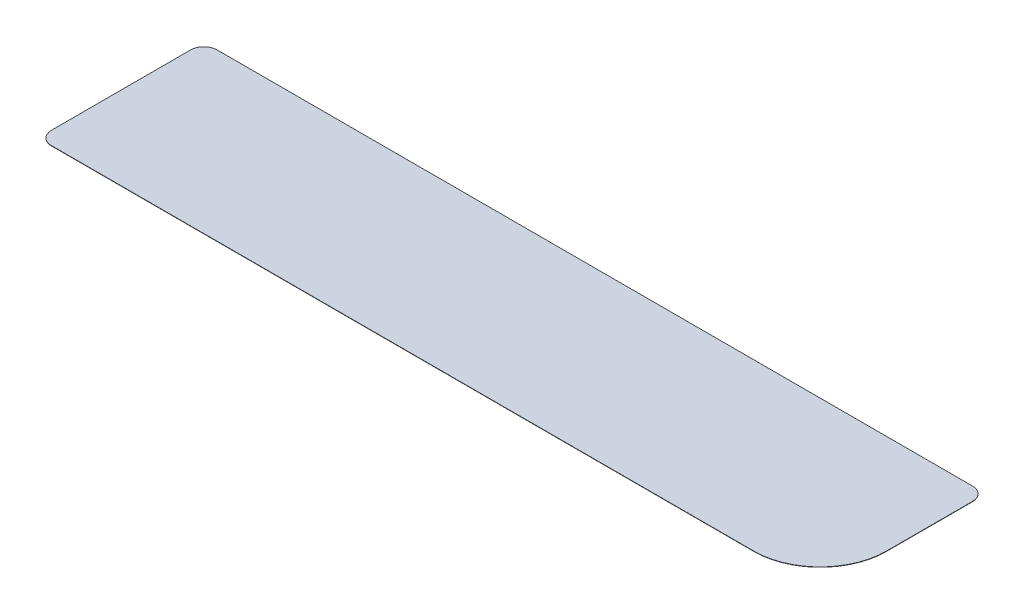
ISO-10303-21;
HEADER;
FILE_DESCRIPTION(('STEP AP214'),'2;1');
FILE_NAME('part.step','',(''),(''),'','','');
FILE_SCHEMA(('AUTOMOTIVE_DESIGN { 1 0 10303 214 1 1 1 1 }'));
ENDSEC;
DATA;
#1=APPLICATION_CONTEXT('core data for automotive mechanical design processes');
#2=APPLICATION_PROTOCOL_DEFINITION('international standard','automotive_design',2000,#1);
#3=PRODUCT_CONTEXT('',#1,'mechanical');
#4=PRODUCT('Part','Part','',(#3));
#5=PRODUCT_RELATED_PRODUCT_CATEGORY('part','',(#4));
#6=PRODUCT_DEFINITION_FORMATION('','',#4);
#7=PRODUCT_DEFINITION_CONTEXT('part definition',#1,'design');
#8=PRODUCT_DEFINITION('design','',#6,#7);
#9=PRODUCT_DEFINITION_SHAPE('','',#8);
#10=(LENGTH_UNIT() NAMED_UNIT(*) SI_UNIT(.MILLI.,.METRE.));
#11=(NAMED_UNIT(*) PLANE_ANGLE_UNIT() SI_UNIT($,.RADIAN.));
#12=(NAMED_UNIT(*) SI_UNIT($,.STERADIAN.) SOLID_ANGLE_UNIT());
#13=UNCERTAINTY_MEASURE_WITH_UNIT(LENGTH_MEASURE(1.E-05),#10,'distance_accuracy_value','');
#14=(GEOMETRIC_REPRESENTATION_CONTEXT(3) GLOBAL_UNCERTAINTY_ASSIGNED_CONTEXT((#13)) GLOBAL_UNIT_ASSIGNED_CONTEXT((#10,
#11,#12)) REPRESENTATION_CONTEXT('',''));
#15=CARTESIAN_POINT('',(0.,0.,0.));
#16=DIRECTION('',(0.,0.,1.));
#17=DIRECTION('',(1.,0.,0.));
#18=AXIS2_PLACEMENT_3D('',#15,#16,#17);
#19=CARTESIAN_POINT('',(116.,0.05,-10.5));
#20=DIRECTION('',(0.,-1.,0.));
#21=DIRECTION('',(0.,0.,-1.));
#22=AXIS2_PLACEMENT_3D('',#19,#20,#21);
#23=CYLINDRICAL_SURFACE('',#22,2.);
#24=CARTESIAN_POINT('',(116.,0.,-10.5));
#25=DIRECTION('',(0.,1.,0.));
#26=DIRECTION('',(0.,0.,-1.));
#27=AXIS2_PLACEMENT_3D('',#24,#25,#26);
#28=CIRCLE('',#27,2.);
#29=CARTESIAN_POINT('',(118.,0.,-10.5));
#30=VERTEX_POINT('',#29);
#31=CARTESIAN_POINT('',(116.,0.,-12.5));
#32=VERTEX_POINT('',#31);
#33=EDGE_CURVE('E135',#30,#32,#28,.T.);
#34=ORIENTED_EDGE('',*,*,#33,.T.);
#35=DIRECTION('',(0.,-1.,0.));
#36=VECTOR('',#35,1.);
#37=CARTESIAN_POINT('',(116.,0.05,-12.5));
#38=LINE('',#37,#36);
#39=CARTESIAN_POINT('',(116.,0.05,-12.5));
#40=VERTEX_POINT('',#39);
#41=EDGE_CURVE('E11',#40,#32,#38,.T.);
#42=ORIENTED_EDGE('',*,*,#41,.F.);
#43=CARTESIAN_POINT('',(116.,0.05,-10.5));
#44=DIRECTION('',(0.,1.,0.));
#45=DIRECTION('',(0.,0.,-1.));
#46=AXIS2_PLACEMENT_3D('',#43,#44,#45);
#47=CIRCLE('',#46,2.);
#48=CARTESIAN_POINT('',(118.,0.05,-10.5));
#49=VERTEX_POINT('',#48);
#50=EDGE_CURVE('E149',#49,#40,#47,.T.);
#51=ORIENTED_EDGE('',*,*,#50,.F.);
#52=DIRECTION('',(0.,-1.,0.));
#53=VECTOR('',#52,1.);
#54=CARTESIAN_POINT('',(118.,0.05,-10.5));
#55=LINE('',#54,#53);
#56=EDGE_CURVE('E131',#49,#30,#55,.T.);
#57=ORIENTED_EDGE('',*,*,#56,.T.);
#58=EDGE_LOOP('',(#34,#42,#51,#57));
#59=FACE_BOUND('',#58,.T.);
#60=ADVANCED_FACE('F39',(#59),#23,.T.);
#61=CARTESIAN_POINT('',(1.99999999999999,0.05,-12.5));
#62=DIRECTION('',(0.,0.,1.));
#63=DIRECTION('',(1.,0.,0.));
#64=AXIS2_PLACEMENT_3D('',#61,#62,#63);
#65=PLANE('',#64);
#66=DIRECTION('',(-1.,0.,0.));
#67=VECTOR('',#66,1.);
#68=CARTESIAN_POINT('',(1.99999999999999,0.,-12.5));
#69=LINE('',#68,#67);
#70=CARTESIAN_POINT('',(1.99999999999999,0.,-12.5));
#71=VERTEX_POINT('',#70);
#72=EDGE_CURVE('E138',#32,#71,#69,.T.);
#73=ORIENTED_EDGE('',*,*,#72,.T.);
#74=DIRECTION('',(0.,-1.,0.));
#75=VECTOR('',#74,1.);
#76=CARTESIAN_POINT('',(1.99999999999999,0.05,-12.5));
#77=LINE('',#76,#75);
#78=CARTESIAN_POINT('',(1.99999999999999,0.05,-12.5));
#79=VERTEX_POINT('',#78);
#80=EDGE_CURVE('E47',#79,#71,#77,.T.);
#81=ORIENTED_EDGE('',*,*,#80,.F.);
#82=DIRECTION('',(-1.,0.,0.));
#83=VECTOR('',#82,1.);
#84=CARTESIAN_POINT('',(1.99999999999999,0.05,-12.5));
#85=LINE('',#84,#83);
#86=EDGE_CURVE('E98',#40,#79,#85,.T.);
#87=ORIENTED_EDGE('',*,*,#86,.F.);
#88=ORIENTED_EDGE('',*,*,#41,.T.);
#89=EDGE_LOOP('',(#73,#81,#87,#88));
#90=FACE_BOUND('',#89,.T.);
#91=ADVANCED_FACE('F184',(#90),#65,.F.);
#92=CARTESIAN_POINT('',(2.,0.05,-10.5));
#93=DIRECTION('',(0.,-1.,0.));
#94=DIRECTION('',(0.,0.,-1.));
#95=AXIS2_PLACEMENT_3D('',#92,#93,#94);
#96=CYLINDRICAL_SURFACE('',#95,2.);
#97=CARTESIAN_POINT('',(2.,0.,-10.5));
#98=DIRECTION('',(0.,1.,0.));
#99=DIRECTION('',(0.,0.,-1.));
#100=AXIS2_PLACEMENT_3D('',#97,#98,#99);
#101=CIRCLE('',#100,2.);
#102=CARTESIAN_POINT('',(0.,0.,-10.5));
#103=VERTEX_POINT('',#102);
#104=EDGE_CURVE('E140',#71,#103,#101,.T.);
#105=ORIENTED_EDGE('',*,*,#104,.T.);
#106=DIRECTION('',(0.,-1.,0.));
#107=VECTOR('',#106,1.);
#108=CARTESIAN_POINT('',(0.,0.05,-10.5));
#109=LINE('',#108,#107);
#110=CARTESIAN_POINT('',(0.,0.05,-10.5));
#111=VERTEX_POINT('',#110);
#112=EDGE_CURVE('E156',#111,#103,#109,.T.);
#113=ORIENTED_EDGE('',*,*,#112,.F.);
#114=CARTESIAN_POINT('',(2.,0.05,-10.5));
#115=DIRECTION('',(0.,1.,0.));
#116=DIRECTION('',(0.,0.,-1.));
#117=AXIS2_PLACEMENT_3D('',#114,#115,#116);
#118=CIRCLE('',#117,2.);
#119=EDGE_CURVE('E164',#79,#111,#118,.T.);
#120=ORIENTED_EDGE('',*,*,#119,.F.);
#121=ORIENTED_EDGE('',*,*,#80,.T.);
#122=EDGE_LOOP('',(#105,#113,#120,#121));
#123=FACE_BOUND('',#122,.T.);
#124=ADVANCED_FACE('F162',(#123),#96,.T.);
#125=CARTESIAN_POINT('',(0.,0.05,-10.5));
#126=DIRECTION('',(1.,0.,0.));
#127=DIRECTION('',(0.,0.,-1.));
#128=AXIS2_PLACEMENT_3D('',#125,#126,#127);
#129=PLANE('',#128);
#130=DIRECTION('',(0.,0.,1.));
#131=VECTOR('',#130,1.);
#132=CARTESIAN_POINT('',(0.,0.,-10.5));
#133=LINE('',#132,#131);
#134=CARTESIAN_POINT('',(0.,0.,10.5));
#135=VERTEX_POINT('',#134);
#136=EDGE_CURVE('E142',#103,#135,#133,.T.);
#137=ORIENTED_EDGE('',*,*,#136,.T.);
#138=DIRECTION('',(0.,-1.,0.));
#139=VECTOR('',#138,1.);
#140=CARTESIAN_POINT('',(0.,0.05,10.5));
#141=LINE('',#140,#139);
#142=CARTESIAN_POINT('',(0.,0.05,10.5));
#143=VERTEX_POINT('',#142);
#144=EDGE_CURVE('E153',#143,#135,#141,.T.);
#145=ORIENTED_EDGE('',*,*,#144,.F.);
#146=DIRECTION('',(0.,0.,1.));
#147=VECTOR('',#146,1.);
#148=CARTESIAN_POINT('',(0.,0.05,-10.5));
#149=LINE('',#148,#147);
#150=EDGE_CURVE('E176',#111,#143,#149,.T.);
#151=ORIENTED_EDGE('',*,*,#150,.F.);
#152=ORIENTED_EDGE('',*,*,#112,.T.);
#153=EDGE_LOOP('',(#137,#145,#151,#152));
#154=FACE_BOUND('',#153,.T.);
#155=ADVANCED_FACE('F172',(#154),#129,.F.);
#156=CARTESIAN_POINT('',(2.,0.05,10.5));
#157=DIRECTION('',(0.,-1.,0.));
#158=DIRECTION('',(0.,0.,-1.));
#159=AXIS2_PLACEMENT_3D('',#156,#157,#158);
#160=CYLINDRICAL_SURFACE('',#159,2.);
#161=CARTESIAN_POINT('',(2.,0.,10.5));
#162=DIRECTION('',(0.,1.,0.));
#163=DIRECTION('',(0.,0.,-1.));
#164=AXIS2_PLACEMENT_3D('',#161,#162,#163);
#165=CIRCLE('',#164,2.);
#166=CARTESIAN_POINT('',(2.,0.,12.5));
#167=VERTEX_POINT('',#166);
#168=EDGE_CURVE('E144',#135,#167,#165,.T.);
#169=ORIENTED_EDGE('',*,*,#168,.T.);
#170=DIRECTION('',(0.,-1.,0.));
#171=VECTOR('',#170,1.);
#172=CARTESIAN_POINT('',(2.,0.05,12.5));
#173=LINE('',#172,#171);
#174=CARTESIAN_POINT('',(2.,0.05,12.5));
#175=VERTEX_POINT('',#174);
#176=EDGE_CURVE('E126',#175,#167,#173,.T.);
#177=ORIENTED_EDGE('',*,*,#176,.F.);
#178=CARTESIAN_POINT('',(2.,0.05,10.5));
#179=DIRECTION('',(0.,1.,0.));
#180=DIRECTION('',(0.,0.,-1.));
#181=AXIS2_PLACEMENT_3D('',#178,#179,#180);
#182=CIRCLE('',#181,2.);
#183=EDGE_CURVE('E117',#143,#175,#182,.T.);
#184=ORIENTED_EDGE('',*,*,#183,.F.);
#185=ORIENTED_EDGE('',*,*,#144,.T.);
#186=EDGE_LOOP('',(#169,#177,#184,#185));
#187=FACE_BOUND('',#186,.T.);
#188=ADVANCED_FACE('F175',(#187),#160,.T.);
#189=CARTESIAN_POINT('',(2.,0.05,12.5));
#190=DIRECTION('',(0.,0.,-1.));
#191=DIRECTION('',(-1.,0.,0.));
#192=AXIS2_PLACEMENT_3D('',#189,#190,#191);
#193=PLANE('',#192);
#194=DIRECTION('',(1.,0.,0.));
#195=VECTOR('',#194,1.);
#196=CARTESIAN_POINT('',(2.,0.,12.5));
#197=LINE('',#196,#195);
#198=CARTESIAN_POINT('',(108.,0.,12.5));
#199=VERTEX_POINT('',#198);
#200=EDGE_CURVE('E125',#167,#199,#197,.T.);
#201=ORIENTED_EDGE('',*,*,#200,.T.);
#202=DIRECTION('',(0.,-1.,0.));
#203=VECTOR('',#202,1.);
#204=CARTESIAN_POINT('',(108.,0.05,12.5));
#205=LINE('',#204,#203);
#206=CARTESIAN_POINT('',(108.,0.05,12.5));
#207=VERTEX_POINT('',#206);
#208=EDGE_CURVE('E122',#207,#199,#205,.T.);
#209=ORIENTED_EDGE('',*,*,#208,.F.);
#210=DIRECTION('',(1.,0.,0.));
#211=VECTOR('',#210,1.);
#212=CARTESIAN_POINT('',(2.,0.05,12.5));
#213=LINE('',#212,#211);
#214=EDGE_CURVE('E111',#175,#207,#213,.T.);
#215=ORIENTED_EDGE('',*,*,#214,.F.);
#216=ORIENTED_EDGE('',*,*,#176,.T.);
#217=EDGE_LOOP('',(#201,#209,#215,#216));
#218=FACE_BOUND('',#217,.T.);
#219=ADVANCED_FACE('F123',(#218),#193,.F.);
#220=CARTESIAN_POINT('',(108.,0.05,2.5));
#221=DIRECTION('',(0.,-1.,0.));
#222=DIRECTION('',(0.,0.,-1.));
#223=AXIS2_PLACEMENT_3D('',#220,#221,#222);
#224=CYLINDRICAL_SURFACE('',#223,10.);
#225=CARTESIAN_POINT('',(108.,0.,2.5));
#226=DIRECTION('',(0.,1.,0.));
#227=DIRECTION('',(0.,0.,-1.));
#228=AXIS2_PLACEMENT_3D('',#225,#226,#227);
#229=CIRCLE('',#228,10.);
#230=CARTESIAN_POINT('',(118.,0.,2.5));
#231=VERTEX_POINT('',#230);
#232=EDGE_CURVE('E84',#199,#231,#229,.T.);
#233=ORIENTED_EDGE('',*,*,#232,.T.);
#234=DIRECTION('',(0.,-1.,0.));
#235=VECTOR('',#234,1.);
#236=CARTESIAN_POINT('',(118.,0.05,2.5));
#237=LINE('',#236,#235);
#238=CARTESIAN_POINT('',(118.,0.05,2.5));
#239=VERTEX_POINT('',#238);
#240=EDGE_CURVE('E127',#239,#231,#237,.T.);
#241=ORIENTED_EDGE('',*,*,#240,.F.);
#242=CARTESIAN_POINT('',(108.,0.05,2.5));
#243=DIRECTION('',(0.,1.,0.));
#244=DIRECTION('',(0.,0.,-1.));
#245=AXIS2_PLACEMENT_3D('',#242,#243,#244);
#246=CIRCLE('',#245,10.);
#247=EDGE_CURVE('E115',#207,#239,#246,.T.);
#248=ORIENTED_EDGE('',*,*,#247,.F.);
#249=ORIENTED_EDGE('',*,*,#208,.T.);
#250=EDGE_LOOP('',(#233,#241,#248,#249));
#251=FACE_BOUND('',#250,.T.);
#252=ADVANCED_FACE('F129',(#251),#224,.T.);
#253=CARTESIAN_POINT('',(118.,0.05,-10.5));
#254=DIRECTION('',(-1.,0.,0.));
#255=DIRECTION('',(0.,0.,1.));
#256=AXIS2_PLACEMENT_3D('',#253,#254,#255);
#257=PLANE('',#256);
#258=DIRECTION('',(0.,0.,-1.));
#259=VECTOR('',#258,1.);
#260=CARTESIAN_POINT('',(118.,0.,-10.5));
#261=LINE('',#260,#259);
#262=EDGE_CURVE('E90',#231,#30,#261,.T.);
#263=ORIENTED_EDGE('',*,*,#262,.T.);
#264=ORIENTED_EDGE('',*,*,#56,.F.);
#265=DIRECTION('',(0.,0.,-1.));
#266=VECTOR('',#265,1.);
#267=CARTESIAN_POINT('',(118.,0.05,-10.5));
#268=LINE('',#267,#266);
#269=EDGE_CURVE('E55',#239,#49,#268,.T.);
#270=ORIENTED_EDGE('',*,*,#269,.F.);
#271=ORIENTED_EDGE('',*,*,#240,.T.);
#272=EDGE_LOOP('',(#263,#264,#270,#271));
#273=FACE_BOUND('',#272,.T.);
#274=ADVANCED_FACE('F200',(#273),#257,.F.);
#275=CARTESIAN_POINT('',(116.,0.05,-10.5));
#276=DIRECTION('',(0.,-1.,0.));
#277=DIRECTION('',(0.,0.,-1.));
#278=AXIS2_PLACEMENT_3D('',#275,#276,#277);
#279=PLANE('',#278);
#280=ORIENTED_EDGE('',*,*,#50,.T.);
#281=ORIENTED_EDGE('',*,*,#86,.T.);
#282=ORIENTED_EDGE('',*,*,#119,.T.);
#283=ORIENTED_EDGE('',*,*,#150,.T.);
#284=ORIENTED_EDGE('',*,*,#183,.T.);
#285=ORIENTED_EDGE('',*,*,#214,.T.);
#286=ORIENTED_EDGE('',*,*,#247,.T.);
#287=ORIENTED_EDGE('',*,*,#269,.T.);
#288=EDGE_LOOP('',(#280,#281,#282,#283,#284,#285,#286,#287));
#289=FACE_BOUND('',#288,.T.);
#290=ADVANCED_FACE('F113',(#289),#279,.F.);
#291=CARTESIAN_POINT('',(116.,0.,-10.5));
#292=DIRECTION('',(0.,-1.,0.));
#293=DIRECTION('',(0.,0.,-1.));
#294=AXIS2_PLACEMENT_3D('',#291,#292,#293);
#295=PLANE('',#294);
#296=ORIENTED_EDGE('',*,*,#33,.F.);
#297=ORIENTED_EDGE('',*,*,#262,.F.);
#298=ORIENTED_EDGE('',*,*,#232,.F.);
#299=ORIENTED_EDGE('',*,*,#200,.F.);
#300=ORIENTED_EDGE('',*,*,#168,.F.);
#301=ORIENTED_EDGE('',*,*,#136,.F.);
#302=ORIENTED_EDGE('',*,*,#104,.F.);
#303=ORIENTED_EDGE('',*,*,#72,.F.);
#304=EDGE_LOOP('',(#296,#297,#298,#299,#300,#301,#302,#303));
#305=FACE_BOUND('',#304,.T.);
#306=ADVANCED_FACE('F168',(#305),#295,.T.);
#307=CLOSED_SHELL('',(#60,#91,#124,#155,#188,#219,#252,#274,#290,#306));
#308=MANIFOLD_SOLID_BREP('B2',#307);
#309=ADVANCED_BREP_SHAPE_REPRESENTATION('',(#18,#308),#14);
#310=SHAPE_DEFINITION_REPRESENTATION(#9,#309);
ENDSEC;
END-ISO-10303-21;
